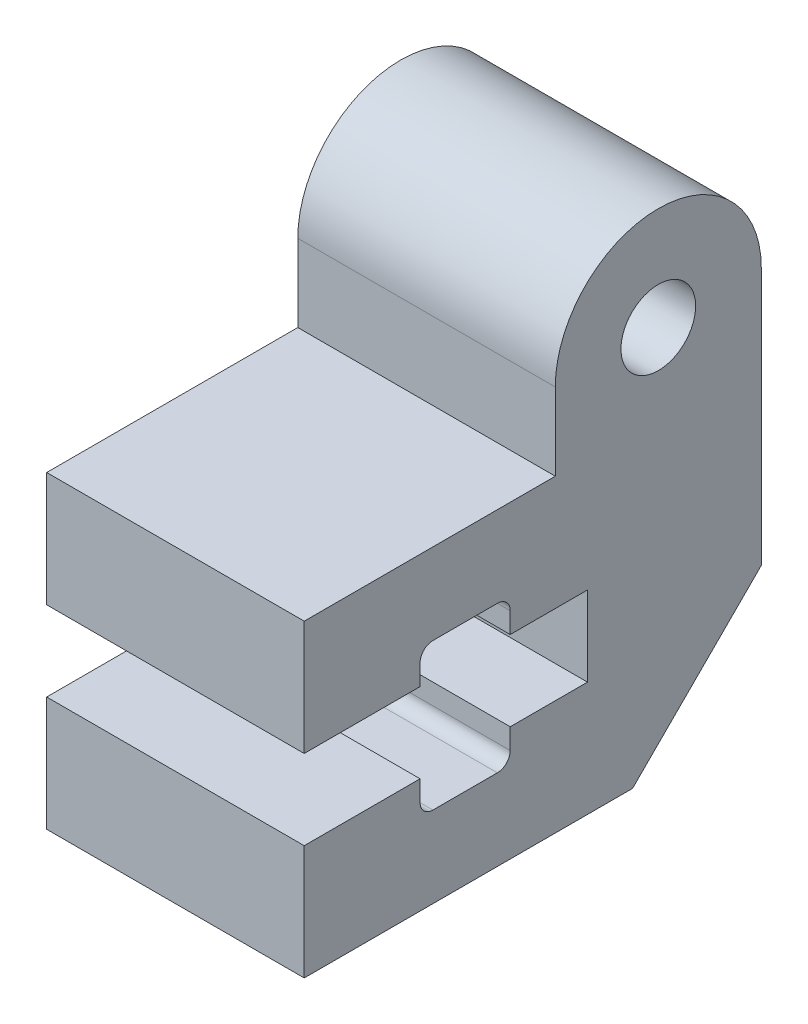
ISO-10303-21;
HEADER;
FILE_DESCRIPTION(('STEP AP214'),'2;1');
FILE_NAME('part.step','',(''),(''),'','','');
FILE_SCHEMA(('AUTOMOTIVE_DESIGN { 1 0 10303 214 1 1 1 1 }'));
ENDSEC;
DATA;
#1=APPLICATION_CONTEXT('core data for automotive mechanical design processes');
#2=APPLICATION_PROTOCOL_DEFINITION('international standard','automotive_design',2000,#1);
#3=PRODUCT_CONTEXT('',#1,'mechanical');
#4=PRODUCT('Part','Part','',(#3));
#5=PRODUCT_RELATED_PRODUCT_CATEGORY('part','',(#4));
#6=PRODUCT_DEFINITION_FORMATION('','',#4);
#7=PRODUCT_DEFINITION_CONTEXT('part definition',#1,'design');
#8=PRODUCT_DEFINITION('design','',#6,#7);
#9=PRODUCT_DEFINITION_SHAPE('','',#8);
#10=(LENGTH_UNIT() NAMED_UNIT(*) SI_UNIT(.MILLI.,.METRE.));
#11=(NAMED_UNIT(*) PLANE_ANGLE_UNIT() SI_UNIT($,.RADIAN.));
#12=(NAMED_UNIT(*) SI_UNIT($,.STERADIAN.) SOLID_ANGLE_UNIT());
#13=UNCERTAINTY_MEASURE_WITH_UNIT(LENGTH_MEASURE(1.E-05),#10,'distance_accuracy_value','');
#14=(GEOMETRIC_REPRESENTATION_CONTEXT(3) GLOBAL_UNCERTAINTY_ASSIGNED_CONTEXT((#13)) GLOBAL_UNIT_ASSIGNED_CONTEXT((#10,
#11,#12)) REPRESENTATION_CONTEXT('',''));
#15=CARTESIAN_POINT('',(0.,0.,0.));
#16=DIRECTION('',(0.,0.,1.));
#17=DIRECTION('',(1.,0.,0.));
#18=AXIS2_PLACEMENT_3D('',#15,#16,#17);
#19=CARTESIAN_POINT('',(10.,3.,-13.75));
#20=DIRECTION('',(1.,0.,0.));
#21=DIRECTION('',(0.,0.,-1.));
#22=AXIS2_PLACEMENT_3D('',#19,#20,#21);
#23=PLANE('',#22);
#24=CARTESIAN_POINT('',(10.,3.,-13.75));
#25=DIRECTION('',(1.,0.,0.));
#26=DIRECTION('',(0.,0.,-1.));
#27=AXIS2_PLACEMENT_3D('',#24,#25,#26);
#28=CIRCLE('',#27,1.45);
#29=CARTESIAN_POINT('',(10.,3.,-15.2));
#30=VERTEX_POINT('',#29);
#31=EDGE_CURVE('E165',#30,#30,#28,.T.);
#32=ORIENTED_EDGE('',*,*,#31,.F.);
#33=EDGE_LOOP('',(#32));
#34=FACE_BOUND('',#33,.T.);
#35=DIRECTION('',(0.,0.707106781186549,-0.707106781186546));
#36=VECTOR('',#35,1.);
#37=CARTESIAN_POINT('',(10.,-6.99999999999998,-17.75));
#38=LINE('',#37,#36);
#39=CARTESIAN_POINT('',(10.,-12.,-12.75));
#40=VERTEX_POINT('',#39);
#41=CARTESIAN_POINT('',(10.,-6.99999999999998,-17.75));
#42=VERTEX_POINT('',#41);
#43=EDGE_CURVE('E308',#40,#42,#38,.T.);
#44=ORIENTED_EDGE('',*,*,#43,.T.);
#45=DIRECTION('',(0.,1.,0.));
#46=VECTOR('',#45,1.);
#47=CARTESIAN_POINT('',(10.,3.,-17.75));
#48=LINE('',#47,#46);
#49=CARTESIAN_POINT('',(10.,3.,-17.75));
#50=VERTEX_POINT('',#49);
#51=EDGE_CURVE('E106',#42,#50,#48,.T.);
#52=ORIENTED_EDGE('',*,*,#51,.T.);
#53=CARTESIAN_POINT('',(10.,3.,-13.75));
#54=DIRECTION('',(1.,0.,0.));
#55=DIRECTION('',(0.,0.,-1.));
#56=AXIS2_PLACEMENT_3D('',#53,#54,#55);
#57=CIRCLE('',#56,4.);
#58=CARTESIAN_POINT('',(10.,3.,-9.75000000000001));
#59=VERTEX_POINT('',#58);
#60=EDGE_CURVE('E99',#50,#59,#57,.T.);
#61=ORIENTED_EDGE('',*,*,#60,.T.);
#62=DIRECTION('',(0.,-1.,0.));
#63=VECTOR('',#62,1.);
#64=CARTESIAN_POINT('',(10.,0.,-9.75000000000001));
#65=LINE('',#64,#63);
#66=CARTESIAN_POINT('',(10.,0.,-9.75000000000001));
#67=VERTEX_POINT('',#66);
#68=EDGE_CURVE('E103',#59,#67,#65,.T.);
#69=ORIENTED_EDGE('',*,*,#68,.T.);
#70=DIRECTION('',(0.,0.,1.));
#71=VECTOR('',#70,1.);
#72=CARTESIAN_POINT('',(10.,0.,0.));
#73=LINE('',#72,#71);
#74=CARTESIAN_POINT('',(10.,0.,0.));
#75=VERTEX_POINT('',#74);
#76=EDGE_CURVE('E58',#67,#75,#73,.T.);
#77=ORIENTED_EDGE('',*,*,#76,.T.);
#78=DIRECTION('',(0.,-1.,0.));
#79=VECTOR('',#78,1.);
#80=CARTESIAN_POINT('',(10.,-12.,0.));
#81=LINE('',#80,#79);
#82=CARTESIAN_POINT('',(10.,-4.45,0.));
#83=VERTEX_POINT('',#82);
#84=EDGE_CURVE('E152',#75,#83,#81,.T.);
#85=ORIENTED_EDGE('',*,*,#84,.T.);
#86=DIRECTION('',(0.,0.,1.));
#87=VECTOR('',#86,1.);
#88=CARTESIAN_POINT('',(10.,-4.45,0.));
#89=LINE('',#88,#87);
#90=CARTESIAN_POINT('',(10.,-4.45,-4.5));
#91=VERTEX_POINT('',#90);
#92=EDGE_CURVE('E257',#91,#83,#89,.T.);
#93=ORIENTED_EDGE('',*,*,#92,.F.);
#94=DIRECTION('',(0.,-1.,0.));
#95=VECTOR('',#94,1.);
#96=CARTESIAN_POINT('',(10.,-4.45,-4.5));
#97=LINE('',#96,#95);
#98=CARTESIAN_POINT('',(10.,-3.65,-4.5));
#99=VERTEX_POINT('',#98);
#100=EDGE_CURVE('E214',#99,#91,#97,.T.);
#101=ORIENTED_EDGE('',*,*,#100,.F.);
#102=CARTESIAN_POINT('',(10.,-3.65,-5.));
#103=DIRECTION('',(1.,0.,0.));
#104=DIRECTION('',(0.,0.,1.));
#105=AXIS2_PLACEMENT_3D('',#102,#103,#104);
#106=CIRCLE('',#105,0.5);
#107=CARTESIAN_POINT('',(10.,-3.15,-5.));
#108=VERTEX_POINT('',#107);
#109=EDGE_CURVE('E218',#108,#99,#106,.T.);
#110=ORIENTED_EDGE('',*,*,#109,.F.);
#111=DIRECTION('',(0.,0.,1.));
#112=VECTOR('',#111,1.);
#113=CARTESIAN_POINT('',(10.,-3.15,-5.));
#114=LINE('',#113,#112);
#115=CARTESIAN_POINT('',(10.,-3.15,-7.5));
#116=VERTEX_POINT('',#115);
#117=EDGE_CURVE('E221',#116,#108,#114,.T.);
#118=ORIENTED_EDGE('',*,*,#117,.F.);
#119=CARTESIAN_POINT('',(10.,-3.65,-7.5));
#120=DIRECTION('',(1.,0.,0.));
#121=DIRECTION('',(0.,0.,1.));
#122=AXIS2_PLACEMENT_3D('',#119,#120,#121);
#123=CIRCLE('',#122,0.5);
#124=CARTESIAN_POINT('',(10.,-3.65,-8.));
#125=VERTEX_POINT('',#124);
#126=EDGE_CURVE('E224',#125,#116,#123,.T.);
#127=ORIENTED_EDGE('',*,*,#126,.F.);
#128=DIRECTION('',(0.,1.,0.));
#129=VECTOR('',#128,1.);
#130=CARTESIAN_POINT('',(10.,-3.65,-8.));
#131=LINE('',#130,#129);
#132=CARTESIAN_POINT('',(10.,-4.45,-8.));
#133=VERTEX_POINT('',#132);
#134=EDGE_CURVE('E227',#133,#125,#131,.T.);
#135=ORIENTED_EDGE('',*,*,#134,.F.);
#136=DIRECTION('',(0.,0.,1.));
#137=VECTOR('',#136,1.);
#138=CARTESIAN_POINT('',(10.,-4.45,-8.));
#139=LINE('',#138,#137);
#140=CARTESIAN_POINT('',(10.,-4.45,-11.));
#141=VERTEX_POINT('',#140);
#142=EDGE_CURVE('E230',#141,#133,#139,.T.);
#143=ORIENTED_EDGE('',*,*,#142,.F.);
#144=DIRECTION('',(0.,1.,0.));
#145=VECTOR('',#144,1.);
#146=CARTESIAN_POINT('',(10.,-4.45,-11.));
#147=LINE('',#146,#145);
#148=CARTESIAN_POINT('',(10.,-7.55,-11.));
#149=VERTEX_POINT('',#148);
#150=EDGE_CURVE('E233',#149,#141,#147,.T.);
#151=ORIENTED_EDGE('',*,*,#150,.F.);
#152=DIRECTION('',(0.,0.,-1.));
#153=VECTOR('',#152,1.);
#154=CARTESIAN_POINT('',(10.,-7.55,-8.));
#155=LINE('',#154,#153);
#156=CARTESIAN_POINT('',(10.,-7.55,-8.));
#157=VERTEX_POINT('',#156);
#158=EDGE_CURVE('E236',#157,#149,#155,.T.);
#159=ORIENTED_EDGE('',*,*,#158,.F.);
#160=DIRECTION('',(0.,1.,0.));
#161=VECTOR('',#160,1.);
#162=CARTESIAN_POINT('',(10.,-8.35,-8.));
#163=LINE('',#162,#161);
#164=CARTESIAN_POINT('',(10.,-8.35,-8.));
#165=VERTEX_POINT('',#164);
#166=EDGE_CURVE('E239',#165,#157,#163,.T.);
#167=ORIENTED_EDGE('',*,*,#166,.F.);
#168=CARTESIAN_POINT('',(10.,-8.35,-7.5));
#169=DIRECTION('',(1.,0.,0.));
#170=DIRECTION('',(0.,0.,-1.));
#171=AXIS2_PLACEMENT_3D('',#168,#169,#170);
#172=CIRCLE('',#171,0.5);
#173=CARTESIAN_POINT('',(10.,-8.85,-7.49999999999999));
#174=VERTEX_POINT('',#173);
#175=EDGE_CURVE('E242',#174,#165,#172,.T.);
#176=ORIENTED_EDGE('',*,*,#175,.F.);
#177=DIRECTION('',(0.,0.,-1.));
#178=VECTOR('',#177,1.);
#179=CARTESIAN_POINT('',(10.,-8.85,-5.));
#180=LINE('',#179,#178);
#181=CARTESIAN_POINT('',(10.,-8.85,-5.));
#182=VERTEX_POINT('',#181);
#183=EDGE_CURVE('E245',#182,#174,#180,.T.);
#184=ORIENTED_EDGE('',*,*,#183,.F.);
#185=CARTESIAN_POINT('',(10.,-8.35,-5.));
#186=DIRECTION('',(1.,0.,0.));
#187=DIRECTION('',(0.,0.,-1.));
#188=AXIS2_PLACEMENT_3D('',#185,#186,#187);
#189=CIRCLE('',#188,0.5);
#190=CARTESIAN_POINT('',(10.,-8.35,-4.5));
#191=VERTEX_POINT('',#190);
#192=EDGE_CURVE('E248',#191,#182,#189,.T.);
#193=ORIENTED_EDGE('',*,*,#192,.F.);
#194=DIRECTION('',(0.,-1.,0.));
#195=VECTOR('',#194,1.);
#196=CARTESIAN_POINT('',(10.,-7.55,-4.5));
#197=LINE('',#196,#195);
#198=CARTESIAN_POINT('',(10.,-7.55,-4.5));
#199=VERTEX_POINT('',#198);
#200=EDGE_CURVE('E251',#199,#191,#197,.T.);
#201=ORIENTED_EDGE('',*,*,#200,.F.);
#202=DIRECTION('',(0.,0.,-1.));
#203=VECTOR('',#202,1.);
#204=CARTESIAN_POINT('',(10.,-7.55,0.));
#205=LINE('',#204,#203);
#206=CARTESIAN_POINT('',(10.,-7.55,0.));
#207=VERTEX_POINT('',#206);
#208=EDGE_CURVE('E254',#207,#199,#205,.T.);
#209=ORIENTED_EDGE('',*,*,#208,.F.);
#210=CARTESIAN_POINT('',(10.,-12.,0.));
#211=VERTEX_POINT('',#210);
#212=EDGE_CURVE('E90',#207,#211,#81,.T.);
#213=ORIENTED_EDGE('',*,*,#212,.T.);
#214=DIRECTION('',(0.,0.,-1.));
#215=VECTOR('',#214,1.);
#216=CARTESIAN_POINT('',(10.,-12.,-17.75));
#217=LINE('',#216,#215);
#218=EDGE_CURVE('E158',#211,#40,#217,.T.);
#219=ORIENTED_EDGE('',*,*,#218,.T.);
#220=EDGE_LOOP('',(#44,#52,#61,#69,#77,#85,#93,#101,#110,#118,#127,#135,#143,#151,#159,#167,
#176,#184,#193,#201,#209,#213,#219));
#221=FACE_BOUND('',#220,.T.);
#222=ADVANCED_FACE('F34',(#34,#221),#23,.T.);
#223=CARTESIAN_POINT('',(0.,3.,-13.75));
#224=DIRECTION('',(1.,0.,0.));
#225=DIRECTION('',(0.,0.,-1.));
#226=AXIS2_PLACEMENT_3D('',#223,#224,#225);
#227=PLANE('',#226);
#228=CARTESIAN_POINT('',(0.,3.,-13.75));
#229=DIRECTION('',(1.,0.,0.));
#230=DIRECTION('',(0.,0.,-1.));
#231=AXIS2_PLACEMENT_3D('',#228,#229,#230);
#232=CIRCLE('',#231,1.45);
#233=CARTESIAN_POINT('',(0.,3.,-15.2));
#234=VERTEX_POINT('',#233);
#235=EDGE_CURVE('E162',#234,#234,#232,.T.);
#236=ORIENTED_EDGE('',*,*,#235,.T.);
#237=EDGE_LOOP('',(#236));
#238=FACE_BOUND('',#237,.T.);
#239=DIRECTION('',(0.,1.,0.));
#240=VECTOR('',#239,1.);
#241=CARTESIAN_POINT('',(0.,3.,-17.75));
#242=LINE('',#241,#240);
#243=CARTESIAN_POINT('',(0.,-6.99999999999998,-17.75));
#244=VERTEX_POINT('',#243);
#245=CARTESIAN_POINT('',(0.,3.,-17.75));
#246=VERTEX_POINT('',#245);
#247=EDGE_CURVE('E133',#244,#246,#242,.T.);
#248=ORIENTED_EDGE('',*,*,#247,.F.);
#249=DIRECTION('',(0.,0.707106781186549,-0.707106781186546));
#250=VECTOR('',#249,1.);
#251=CARTESIAN_POINT('',(0.,-6.99999999999998,-17.75));
#252=LINE('',#251,#250);
#253=CARTESIAN_POINT('',(0.,-12.,-12.75));
#254=VERTEX_POINT('',#253);
#255=EDGE_CURVE('E305',#254,#244,#252,.T.);
#256=ORIENTED_EDGE('',*,*,#255,.F.);
#257=DIRECTION('',(0.,0.,-1.));
#258=VECTOR('',#257,1.);
#259=CARTESIAN_POINT('',(0.,-12.,-17.75));
#260=LINE('',#259,#258);
#261=CARTESIAN_POINT('',(0.,-12.,0.));
#262=VERTEX_POINT('',#261);
#263=EDGE_CURVE('E129',#262,#254,#260,.T.);
#264=ORIENTED_EDGE('',*,*,#263,.F.);
#265=DIRECTION('',(0.,-1.,0.));
#266=VECTOR('',#265,1.);
#267=CARTESIAN_POINT('',(0.,-12.,0.));
#268=LINE('',#267,#266);
#269=CARTESIAN_POINT('',(0.,-7.55,0.));
#270=VERTEX_POINT('',#269);
#271=EDGE_CURVE('E130',#270,#262,#268,.T.);
#272=ORIENTED_EDGE('',*,*,#271,.F.);
#273=DIRECTION('',(0.,0.,-1.));
#274=VECTOR('',#273,1.);
#275=CARTESIAN_POINT('',(0.,-7.55,0.));
#276=LINE('',#275,#274);
#277=CARTESIAN_POINT('',(0.,-7.55,-4.5));
#278=VERTEX_POINT('',#277);
#279=EDGE_CURVE('E49',#270,#278,#276,.T.);
#280=ORIENTED_EDGE('',*,*,#279,.T.);
#281=DIRECTION('',(0.,-1.,0.));
#282=VECTOR('',#281,1.);
#283=CARTESIAN_POINT('',(0.,-7.55,-4.5));
#284=LINE('',#283,#282);
#285=CARTESIAN_POINT('',(0.,-8.35,-4.5));
#286=VERTEX_POINT('',#285);
#287=EDGE_CURVE('E296',#278,#286,#284,.T.);
#288=ORIENTED_EDGE('',*,*,#287,.T.);
#289=CARTESIAN_POINT('',(0.,-8.35,-5.));
#290=DIRECTION('',(1.,0.,0.));
#291=DIRECTION('',(0.,0.,-1.));
#292=AXIS2_PLACEMENT_3D('',#289,#290,#291);
#293=CIRCLE('',#292,0.5);
#294=CARTESIAN_POINT('',(0.,-8.85,-5.));
#295=VERTEX_POINT('',#294);
#296=EDGE_CURVE('E293',#286,#295,#293,.T.);
#297=ORIENTED_EDGE('',*,*,#296,.T.);
#298=DIRECTION('',(0.,0.,-1.));
#299=VECTOR('',#298,1.);
#300=CARTESIAN_POINT('',(0.,-8.85,-5.));
#301=LINE('',#300,#299);
#302=CARTESIAN_POINT('',(0.,-8.85,-7.49999999999999));
#303=VERTEX_POINT('',#302);
#304=EDGE_CURVE('E290',#295,#303,#301,.T.);
#305=ORIENTED_EDGE('',*,*,#304,.T.);
#306=CARTESIAN_POINT('',(0.,-8.35,-7.5));
#307=DIRECTION('',(1.,0.,0.));
#308=DIRECTION('',(0.,0.,-1.));
#309=AXIS2_PLACEMENT_3D('',#306,#307,#308);
#310=CIRCLE('',#309,0.5);
#311=CARTESIAN_POINT('',(0.,-8.35,-8.));
#312=VERTEX_POINT('',#311);
#313=EDGE_CURVE('E287',#303,#312,#310,.T.);
#314=ORIENTED_EDGE('',*,*,#313,.T.);
#315=DIRECTION('',(0.,1.,0.));
#316=VECTOR('',#315,1.);
#317=CARTESIAN_POINT('',(0.,-8.35,-8.));
#318=LINE('',#317,#316);
#319=CARTESIAN_POINT('',(0.,-7.55,-8.));
#320=VERTEX_POINT('',#319);
#321=EDGE_CURVE('E284',#312,#320,#318,.T.);
#322=ORIENTED_EDGE('',*,*,#321,.T.);
#323=DIRECTION('',(0.,0.,-1.));
#324=VECTOR('',#323,1.);
#325=CARTESIAN_POINT('',(0.,-7.55,-8.));
#326=LINE('',#325,#324);
#327=CARTESIAN_POINT('',(0.,-7.55,-11.));
#328=VERTEX_POINT('',#327);
#329=EDGE_CURVE('E281',#320,#328,#326,.T.);
#330=ORIENTED_EDGE('',*,*,#329,.T.);
#331=DIRECTION('',(0.,1.,0.));
#332=VECTOR('',#331,1.);
#333=CARTESIAN_POINT('',(0.,-4.45,-11.));
#334=LINE('',#333,#332);
#335=CARTESIAN_POINT('',(0.,-4.45,-11.));
#336=VERTEX_POINT('',#335);
#337=EDGE_CURVE('E278',#328,#336,#334,.T.);
#338=ORIENTED_EDGE('',*,*,#337,.T.);
#339=DIRECTION('',(0.,0.,1.));
#340=VECTOR('',#339,1.);
#341=CARTESIAN_POINT('',(0.,-4.45,-8.));
#342=LINE('',#341,#340);
#343=CARTESIAN_POINT('',(0.,-4.45,-8.));
#344=VERTEX_POINT('',#343);
#345=EDGE_CURVE('E275',#336,#344,#342,.T.);
#346=ORIENTED_EDGE('',*,*,#345,.T.);
#347=DIRECTION('',(0.,1.,0.));
#348=VECTOR('',#347,1.);
#349=CARTESIAN_POINT('',(0.,-3.65,-8.));
#350=LINE('',#349,#348);
#351=CARTESIAN_POINT('',(0.,-3.65,-8.));
#352=VERTEX_POINT('',#351);
#353=EDGE_CURVE('E272',#344,#352,#350,.T.);
#354=ORIENTED_EDGE('',*,*,#353,.T.);
#355=CARTESIAN_POINT('',(0.,-3.65,-7.5));
#356=DIRECTION('',(1.,0.,0.));
#357=DIRECTION('',(0.,0.,1.));
#358=AXIS2_PLACEMENT_3D('',#355,#356,#357);
#359=CIRCLE('',#358,0.5);
#360=CARTESIAN_POINT('',(0.,-3.15,-7.5));
#361=VERTEX_POINT('',#360);
#362=EDGE_CURVE('E269',#352,#361,#359,.T.);
#363=ORIENTED_EDGE('',*,*,#362,.T.);
#364=DIRECTION('',(0.,0.,1.));
#365=VECTOR('',#364,1.);
#366=CARTESIAN_POINT('',(0.,-3.15,-5.));
#367=LINE('',#366,#365);
#368=CARTESIAN_POINT('',(0.,-3.15,-5.));
#369=VERTEX_POINT('',#368);
#370=EDGE_CURVE('E266',#361,#369,#367,.T.);
#371=ORIENTED_EDGE('',*,*,#370,.T.);
#372=CARTESIAN_POINT('',(0.,-3.65,-5.));
#373=DIRECTION('',(1.,0.,0.));
#374=DIRECTION('',(0.,0.,1.));
#375=AXIS2_PLACEMENT_3D('',#372,#373,#374);
#376=CIRCLE('',#375,0.5);
#377=CARTESIAN_POINT('',(0.,-3.65,-4.5));
#378=VERTEX_POINT('',#377);
#379=EDGE_CURVE('E263',#369,#378,#376,.T.);
#380=ORIENTED_EDGE('',*,*,#379,.T.);
#381=DIRECTION('',(0.,-1.,0.));
#382=VECTOR('',#381,1.);
#383=CARTESIAN_POINT('',(0.,-4.45,-4.5));
#384=LINE('',#383,#382);
#385=CARTESIAN_POINT('',(0.,-4.45,-4.5));
#386=VERTEX_POINT('',#385);
#387=EDGE_CURVE('E171',#378,#386,#384,.T.);
#388=ORIENTED_EDGE('',*,*,#387,.T.);
#389=DIRECTION('',(0.,0.,1.));
#390=VECTOR('',#389,1.);
#391=CARTESIAN_POINT('',(0.,-4.45,0.));
#392=LINE('',#391,#390);
#393=CARTESIAN_POINT('',(0.,-4.45,0.));
#394=VERTEX_POINT('',#393);
#395=EDGE_CURVE('E217',#386,#394,#392,.T.);
#396=ORIENTED_EDGE('',*,*,#395,.T.);
#397=CARTESIAN_POINT('',(0.,0.,0.));
#398=VERTEX_POINT('',#397);
#399=EDGE_CURVE('E126',#398,#394,#268,.T.);
#400=ORIENTED_EDGE('',*,*,#399,.F.);
#401=DIRECTION('',(0.,0.,1.));
#402=VECTOR('',#401,1.);
#403=CARTESIAN_POINT('',(0.,0.,0.));
#404=LINE('',#403,#402);
#405=CARTESIAN_POINT('',(0.,0.,-9.75000000000001));
#406=VERTEX_POINT('',#405);
#407=EDGE_CURVE('E82',#406,#398,#404,.T.);
#408=ORIENTED_EDGE('',*,*,#407,.F.);
#409=DIRECTION('',(0.,-1.,0.));
#410=VECTOR('',#409,1.);
#411=CARTESIAN_POINT('',(0.,0.,-9.75000000000001));
#412=LINE('',#411,#410);
#413=CARTESIAN_POINT('',(0.,3.,-9.75000000000001));
#414=VERTEX_POINT('',#413);
#415=EDGE_CURVE('E136',#414,#406,#412,.T.);
#416=ORIENTED_EDGE('',*,*,#415,.F.);
#417=CARTESIAN_POINT('',(0.,3.,-13.75));
#418=DIRECTION('',(1.,0.,0.));
#419=DIRECTION('',(0.,0.,-1.));
#420=AXIS2_PLACEMENT_3D('',#417,#418,#419);
#421=CIRCLE('',#420,4.);
#422=EDGE_CURVE('E115',#246,#414,#421,.T.);
#423=ORIENTED_EDGE('',*,*,#422,.F.);
#424=EDGE_LOOP('',(#248,#256,#264,#272,#280,#288,#297,#305,#314,#322,#330,#338,#346,#354,#363,
#371,#380,#388,#396,#400,#408,#416,#423));
#425=FACE_BOUND('',#424,.T.);
#426=ADVANCED_FACE('F143',(#238,#425),#227,.F.);
#427=CARTESIAN_POINT('',(10.,-12.,-17.75));
#428=DIRECTION('',(0.,1.,0.));
#429=DIRECTION('',(0.,0.,1.));
#430=AXIS2_PLACEMENT_3D('',#427,#428,#429);
#431=PLANE('',#430);
#432=DIRECTION('',(1.,0.,0.));
#433=VECTOR('',#432,1.);
#434=CARTESIAN_POINT('',(0.,-12.,-12.75));
#435=LINE('',#434,#433);
#436=EDGE_CURVE('E302',#254,#40,#435,.T.);
#437=ORIENTED_EDGE('',*,*,#436,.T.);
#438=ORIENTED_EDGE('',*,*,#218,.F.);
#439=DIRECTION('',(-1.,0.,0.));
#440=VECTOR('',#439,1.);
#441=CARTESIAN_POINT('',(10.,-12.,0.));
#442=LINE('',#441,#440);
#443=EDGE_CURVE('E12',#211,#262,#442,.T.);
#444=ORIENTED_EDGE('',*,*,#443,.T.);
#445=ORIENTED_EDGE('',*,*,#263,.T.);
#446=EDGE_LOOP('',(#437,#438,#444,#445));
#447=FACE_BOUND('',#446,.T.);
#448=ADVANCED_FACE('F322',(#447),#431,.F.);
#449=CARTESIAN_POINT('',(10.,-12.,0.));
#450=DIRECTION('',(0.,0.,-1.));
#451=DIRECTION('',(-1.,0.,0.));
#452=AXIS2_PLACEMENT_3D('',#449,#450,#451);
#453=PLANE('',#452);
#454=ORIENTED_EDGE('',*,*,#399,.T.);
#455=DIRECTION('',(1.,0.,0.));
#456=VECTOR('',#455,1.);
#457=CARTESIAN_POINT('',(0.,-4.45,0.));
#458=LINE('',#457,#456);
#459=EDGE_CURVE('E156',#394,#83,#458,.T.);
#460=ORIENTED_EDGE('',*,*,#459,.T.);
#461=ORIENTED_EDGE('',*,*,#84,.F.);
#462=DIRECTION('',(-1.,0.,0.));
#463=VECTOR('',#462,1.);
#464=CARTESIAN_POINT('',(10.,0.,0.));
#465=LINE('',#464,#463);
#466=EDGE_CURVE('E122',#75,#398,#465,.T.);
#467=ORIENTED_EDGE('',*,*,#466,.T.);
#468=EDGE_LOOP('',(#454,#460,#461,#467));
#469=FACE_BOUND('',#468,.T.);
#470=ADVANCED_FACE('F153',(#469),#453,.F.);
#471=ORIENTED_EDGE('',*,*,#212,.F.);
#472=DIRECTION('',(1.,0.,0.));
#473=VECTOR('',#472,1.);
#474=CARTESIAN_POINT('',(0.,-7.55,0.));
#475=LINE('',#474,#473);
#476=EDGE_CURVE('E170',#270,#207,#475,.T.);
#477=ORIENTED_EDGE('',*,*,#476,.F.);
#478=ORIENTED_EDGE('',*,*,#271,.T.);
#479=ORIENTED_EDGE('',*,*,#443,.F.);
#480=EDGE_LOOP('',(#471,#477,#478,#479));
#481=FACE_BOUND('',#480,.T.);
#482=ADVANCED_FACE('F36',(#481),#453,.F.);
#483=CARTESIAN_POINT('',(10.,3.,-17.75));
#484=DIRECTION('',(0.,0.,1.));
#485=DIRECTION('',(1.,0.,0.));
#486=AXIS2_PLACEMENT_3D('',#483,#484,#485);
#487=PLANE('',#486);
#488=ORIENTED_EDGE('',*,*,#247,.T.);
#489=DIRECTION('',(-1.,0.,0.));
#490=VECTOR('',#489,1.);
#491=CARTESIAN_POINT('',(10.,3.,-17.75));
#492=LINE('',#491,#490);
#493=EDGE_CURVE('E42',#50,#246,#492,.T.);
#494=ORIENTED_EDGE('',*,*,#493,.F.);
#495=ORIENTED_EDGE('',*,*,#51,.F.);
#496=DIRECTION('',(1.,0.,0.));
#497=VECTOR('',#496,1.);
#498=CARTESIAN_POINT('',(0.,-6.99999999999998,-17.75));
#499=LINE('',#498,#497);
#500=EDGE_CURVE('E260',#244,#42,#499,.T.);
#501=ORIENTED_EDGE('',*,*,#500,.F.);
#502=EDGE_LOOP('',(#488,#494,#495,#501));
#503=FACE_BOUND('',#502,.T.);
#504=ADVANCED_FACE('F480',(#503),#487,.F.);
#505=CARTESIAN_POINT('',(10.,3.,-13.75));
#506=DIRECTION('',(-1.,0.,0.));
#507=DIRECTION('',(0.,0.,1.));
#508=AXIS2_PLACEMENT_3D('',#505,#506,#507);
#509=CYLINDRICAL_SURFACE('',#508,4.);
#510=ORIENTED_EDGE('',*,*,#422,.T.);
#511=DIRECTION('',(-1.,0.,0.));
#512=VECTOR('',#511,1.);
#513=CARTESIAN_POINT('',(10.,3.,-9.75000000000001));
#514=LINE('',#513,#512);
#515=EDGE_CURVE('E112',#59,#414,#514,.T.);
#516=ORIENTED_EDGE('',*,*,#515,.F.);
#517=ORIENTED_EDGE('',*,*,#60,.F.);
#518=ORIENTED_EDGE('',*,*,#493,.T.);
#519=EDGE_LOOP('',(#510,#516,#517,#518));
#520=FACE_BOUND('',#519,.T.);
#521=ADVANCED_FACE('F113',(#520),#509,.T.);
#522=CARTESIAN_POINT('',(10.,0.,-9.75000000000001));
#523=DIRECTION('',(0.,0.,-1.));
#524=DIRECTION('',(0.,1.,0.));
#525=AXIS2_PLACEMENT_3D('',#522,#523,#524);
#526=PLANE('',#525);
#527=ORIENTED_EDGE('',*,*,#415,.T.);
#528=DIRECTION('',(-1.,0.,0.));
#529=VECTOR('',#528,1.);
#530=CARTESIAN_POINT('',(10.,0.,-9.75000000000001));
#531=LINE('',#530,#529);
#532=EDGE_CURVE('E118',#67,#406,#531,.T.);
#533=ORIENTED_EDGE('',*,*,#532,.F.);
#534=ORIENTED_EDGE('',*,*,#68,.F.);
#535=ORIENTED_EDGE('',*,*,#515,.T.);
#536=EDGE_LOOP('',(#527,#533,#534,#535));
#537=FACE_BOUND('',#536,.T.);
#538=ADVANCED_FACE('F120',(#537),#526,.F.);
#539=CARTESIAN_POINT('',(10.,0.,0.));
#540=DIRECTION('',(0.,-1.,0.));
#541=DIRECTION('',(0.,0.,-1.));
#542=AXIS2_PLACEMENT_3D('',#539,#540,#541);
#543=PLANE('',#542);
#544=ORIENTED_EDGE('',*,*,#407,.T.);
#545=ORIENTED_EDGE('',*,*,#466,.F.);
#546=ORIENTED_EDGE('',*,*,#76,.F.);
#547=ORIENTED_EDGE('',*,*,#532,.T.);
#548=EDGE_LOOP('',(#544,#545,#546,#547));
#549=FACE_BOUND('',#548,.T.);
#550=ADVANCED_FACE('F148',(#549),#543,.F.);
#551=CARTESIAN_POINT('',(10.,3.,-13.75));
#552=DIRECTION('',(-1.,0.,0.));
#553=DIRECTION('',(0.,0.,1.));
#554=AXIS2_PLACEMENT_3D('',#551,#552,#553);
#555=CYLINDRICAL_SURFACE('',#554,1.45);
#556=ORIENTED_EDGE('',*,*,#31,.T.);
#557=EDGE_LOOP('',(#556));
#558=FACE_BOUND('',#557,.T.);
#559=ORIENTED_EDGE('',*,*,#235,.F.);
#560=EDGE_LOOP('',(#559));
#561=FACE_BOUND('',#560,.T.);
#562=ADVANCED_FACE('F472',(#558,#561),#555,.F.);
#563=CARTESIAN_POINT('',(0.,-4.45,0.));
#564=DIRECTION('',(0.,1.,0.));
#565=DIRECTION('',(0.,0.,1.));
#566=AXIS2_PLACEMENT_3D('',#563,#564,#565);
#567=PLANE('',#566);
#568=ORIENTED_EDGE('',*,*,#92,.T.);
#569=ORIENTED_EDGE('',*,*,#459,.F.);
#570=ORIENTED_EDGE('',*,*,#395,.F.);
#571=DIRECTION('',(1.,0.,0.));
#572=VECTOR('',#571,1.);
#573=CARTESIAN_POINT('',(0.,-4.45,-4.5));
#574=LINE('',#573,#572);
#575=EDGE_CURVE('E166',#386,#91,#574,.T.);
#576=ORIENTED_EDGE('',*,*,#575,.T.);
#577=EDGE_LOOP('',(#568,#569,#570,#576));
#578=FACE_BOUND('',#577,.T.);
#579=ADVANCED_FACE('F402',(#578),#567,.F.);
#580=CARTESIAN_POINT('',(0.,-4.45,-4.5));
#581=DIRECTION('',(0.,0.,1.));
#582=DIRECTION('',(1.,0.,0.));
#583=AXIS2_PLACEMENT_3D('',#580,#581,#582);
#584=PLANE('',#583);
#585=ORIENTED_EDGE('',*,*,#100,.T.);
#586=ORIENTED_EDGE('',*,*,#575,.F.);
#587=ORIENTED_EDGE('',*,*,#387,.F.);
#588=DIRECTION('',(1.,0.,0.));
#589=VECTOR('',#588,1.);
#590=CARTESIAN_POINT('',(0.,-3.65,-4.5));
#591=LINE('',#590,#589);
#592=EDGE_CURVE('E209',#378,#99,#591,.T.);
#593=ORIENTED_EDGE('',*,*,#592,.T.);
#594=EDGE_LOOP('',(#585,#586,#587,#593));
#595=FACE_BOUND('',#594,.T.);
#596=ADVANCED_FACE('F404',(#595),#584,.F.);
#597=CARTESIAN_POINT('',(0.,-3.65,-5.));
#598=DIRECTION('',(1.,0.,0.));
#599=DIRECTION('',(0.,0.,-1.));
#600=AXIS2_PLACEMENT_3D('',#597,#598,#599);
#601=CYLINDRICAL_SURFACE('',#600,0.5);
#602=ORIENTED_EDGE('',*,*,#109,.T.);
#603=ORIENTED_EDGE('',*,*,#592,.F.);
#604=ORIENTED_EDGE('',*,*,#379,.F.);
#605=DIRECTION('',(1.,0.,0.));
#606=VECTOR('',#605,1.);
#607=CARTESIAN_POINT('',(0.,-3.15,-5.));
#608=LINE('',#607,#606);
#609=EDGE_CURVE('E206',#369,#108,#608,.T.);
#610=ORIENTED_EDGE('',*,*,#609,.T.);
#611=EDGE_LOOP('',(#602,#603,#604,#610));
#612=FACE_BOUND('',#611,.T.);
#613=ADVANCED_FACE('F409',(#612),#601,.F.);
#614=CARTESIAN_POINT('',(0.,-3.15,-5.));
#615=DIRECTION('',(0.,1.,0.));
#616=DIRECTION('',(0.,0.,1.));
#617=AXIS2_PLACEMENT_3D('',#614,#615,#616);
#618=PLANE('',#617);
#619=ORIENTED_EDGE('',*,*,#117,.T.);
#620=ORIENTED_EDGE('',*,*,#609,.F.);
#621=ORIENTED_EDGE('',*,*,#370,.F.);
#622=DIRECTION('',(1.,0.,0.));
#623=VECTOR('',#622,1.);
#624=CARTESIAN_POINT('',(0.,-3.15,-7.5));
#625=LINE('',#624,#623);
#626=EDGE_CURVE('E203',#361,#116,#625,.T.);
#627=ORIENTED_EDGE('',*,*,#626,.T.);
#628=EDGE_LOOP('',(#619,#620,#621,#627));
#629=FACE_BOUND('',#628,.T.);
#630=ADVANCED_FACE('F413',(#629),#618,.F.);
#631=CARTESIAN_POINT('',(0.,-3.65,-7.5));
#632=DIRECTION('',(1.,0.,0.));
#633=DIRECTION('',(0.,0.,-1.));
#634=AXIS2_PLACEMENT_3D('',#631,#632,#633);
#635=CYLINDRICAL_SURFACE('',#634,0.5);
#636=ORIENTED_EDGE('',*,*,#126,.T.);
#637=ORIENTED_EDGE('',*,*,#626,.F.);
#638=ORIENTED_EDGE('',*,*,#362,.F.);
#639=DIRECTION('',(1.,0.,0.));
#640=VECTOR('',#639,1.);
#641=CARTESIAN_POINT('',(0.,-3.65,-8.));
#642=LINE('',#641,#640);
#643=EDGE_CURVE('E200',#352,#125,#642,.T.);
#644=ORIENTED_EDGE('',*,*,#643,.T.);
#645=EDGE_LOOP('',(#636,#637,#638,#644));
#646=FACE_BOUND('',#645,.T.);
#647=ADVANCED_FACE('F416',(#646),#635,.F.);
#648=CARTESIAN_POINT('',(0.,-3.65,-8.));
#649=DIRECTION('',(0.,0.,-1.));
#650=DIRECTION('',(-1.,0.,0.));
#651=AXIS2_PLACEMENT_3D('',#648,#649,#650);
#652=PLANE('',#651);
#653=ORIENTED_EDGE('',*,*,#134,.T.);
#654=ORIENTED_EDGE('',*,*,#643,.F.);
#655=ORIENTED_EDGE('',*,*,#353,.F.);
#656=DIRECTION('',(1.,0.,0.));
#657=VECTOR('',#656,1.);
#658=CARTESIAN_POINT('',(0.,-4.45,-8.));
#659=LINE('',#658,#657);
#660=EDGE_CURVE('E197',#344,#133,#659,.T.);
#661=ORIENTED_EDGE('',*,*,#660,.T.);
#662=EDGE_LOOP('',(#653,#654,#655,#661));
#663=FACE_BOUND('',#662,.T.);
#664=ADVANCED_FACE('F421',(#663),#652,.F.);
#665=CARTESIAN_POINT('',(0.,-4.45,-8.));
#666=DIRECTION('',(0.,1.,0.));
#667=DIRECTION('',(0.,0.,1.));
#668=AXIS2_PLACEMENT_3D('',#665,#666,#667);
#669=PLANE('',#668);
#670=ORIENTED_EDGE('',*,*,#142,.T.);
#671=ORIENTED_EDGE('',*,*,#660,.F.);
#672=ORIENTED_EDGE('',*,*,#345,.F.);
#673=DIRECTION('',(1.,0.,0.));
#674=VECTOR('',#673,1.);
#675=CARTESIAN_POINT('',(0.,-4.45,-11.));
#676=LINE('',#675,#674);
#677=EDGE_CURVE('E194',#336,#141,#676,.T.);
#678=ORIENTED_EDGE('',*,*,#677,.T.);
#679=EDGE_LOOP('',(#670,#671,#672,#678));
#680=FACE_BOUND('',#679,.T.);
#681=ADVANCED_FACE('F425',(#680),#669,.F.);
#682=CARTESIAN_POINT('',(0.,-4.45,-11.));
#683=DIRECTION('',(0.,0.,-1.));
#684=DIRECTION('',(-1.,0.,0.));
#685=AXIS2_PLACEMENT_3D('',#682,#683,#684);
#686=PLANE('',#685);
#687=ORIENTED_EDGE('',*,*,#150,.T.);
#688=ORIENTED_EDGE('',*,*,#677,.F.);
#689=ORIENTED_EDGE('',*,*,#337,.F.);
#690=DIRECTION('',(1.,0.,0.));
#691=VECTOR('',#690,1.);
#692=CARTESIAN_POINT('',(0.,-7.55,-11.));
#693=LINE('',#692,#691);
#694=EDGE_CURVE('E191',#328,#149,#693,.T.);
#695=ORIENTED_EDGE('',*,*,#694,.T.);
#696=EDGE_LOOP('',(#687,#688,#689,#695));
#697=FACE_BOUND('',#696,.T.);
#698=ADVANCED_FACE('F428',(#697),#686,.F.);
#699=CARTESIAN_POINT('',(0.,-7.55,-8.));
#700=DIRECTION('',(0.,-1.,0.));
#701=DIRECTION('',(0.,0.,-1.));
#702=AXIS2_PLACEMENT_3D('',#699,#700,#701);
#703=PLANE('',#702);
#704=ORIENTED_EDGE('',*,*,#158,.T.);
#705=ORIENTED_EDGE('',*,*,#694,.F.);
#706=ORIENTED_EDGE('',*,*,#329,.F.);
#707=DIRECTION('',(1.,0.,0.));
#708=VECTOR('',#707,1.);
#709=CARTESIAN_POINT('',(0.,-7.55,-8.));
#710=LINE('',#709,#708);
#711=EDGE_CURVE('E188',#320,#157,#710,.T.);
#712=ORIENTED_EDGE('',*,*,#711,.T.);
#713=EDGE_LOOP('',(#704,#705,#706,#712));
#714=FACE_BOUND('',#713,.T.);
#715=ADVANCED_FACE('F433',(#714),#703,.F.);
#716=CARTESIAN_POINT('',(0.,-8.35,-8.));
#717=DIRECTION('',(0.,0.,-1.));
#718=DIRECTION('',(-1.,0.,0.));
#719=AXIS2_PLACEMENT_3D('',#716,#717,#718);
#720=PLANE('',#719);
#721=ORIENTED_EDGE('',*,*,#166,.T.);
#722=ORIENTED_EDGE('',*,*,#711,.F.);
#723=ORIENTED_EDGE('',*,*,#321,.F.);
#724=DIRECTION('',(1.,0.,0.));
#725=VECTOR('',#724,1.);
#726=CARTESIAN_POINT('',(0.,-8.35,-8.));
#727=LINE('',#726,#725);
#728=EDGE_CURVE('E185',#312,#165,#727,.T.);
#729=ORIENTED_EDGE('',*,*,#728,.T.);
#730=EDGE_LOOP('',(#721,#722,#723,#729));
#731=FACE_BOUND('',#730,.T.);
#732=ADVANCED_FACE('F437',(#731),#720,.F.);
#733=CARTESIAN_POINT('',(0.,-8.35,-7.5));
#734=DIRECTION('',(1.,0.,0.));
#735=DIRECTION('',(0.,0.,-1.));
#736=AXIS2_PLACEMENT_3D('',#733,#734,#735);
#737=CYLINDRICAL_SURFACE('',#736,0.5);
#738=ORIENTED_EDGE('',*,*,#175,.T.);
#739=ORIENTED_EDGE('',*,*,#728,.F.);
#740=ORIENTED_EDGE('',*,*,#313,.F.);
#741=DIRECTION('',(1.,0.,0.));
#742=VECTOR('',#741,1.);
#743=CARTESIAN_POINT('',(0.,-8.85,-7.49999999999999));
#744=LINE('',#743,#742);
#745=EDGE_CURVE('E182',#303,#174,#744,.T.);
#746=ORIENTED_EDGE('',*,*,#745,.T.);
#747=EDGE_LOOP('',(#738,#739,#740,#746));
#748=FACE_BOUND('',#747,.T.);
#749=ADVANCED_FACE('F440',(#748),#737,.F.);
#750=CARTESIAN_POINT('',(0.,-8.85,-5.));
#751=DIRECTION('',(0.,-1.,0.));
#752=DIRECTION('',(0.,0.,-1.));
#753=AXIS2_PLACEMENT_3D('',#750,#751,#752);
#754=PLANE('',#753);
#755=ORIENTED_EDGE('',*,*,#183,.T.);
#756=ORIENTED_EDGE('',*,*,#745,.F.);
#757=ORIENTED_EDGE('',*,*,#304,.F.);
#758=DIRECTION('',(1.,0.,0.));
#759=VECTOR('',#758,1.);
#760=CARTESIAN_POINT('',(0.,-8.85,-5.));
#761=LINE('',#760,#759);
#762=EDGE_CURVE('E179',#295,#182,#761,.T.);
#763=ORIENTED_EDGE('',*,*,#762,.T.);
#764=EDGE_LOOP('',(#755,#756,#757,#763));
#765=FACE_BOUND('',#764,.T.);
#766=ADVANCED_FACE('F445',(#765),#754,.F.);
#767=CARTESIAN_POINT('',(0.,-8.35,-5.));
#768=DIRECTION('',(1.,0.,0.));
#769=DIRECTION('',(0.,0.,-1.));
#770=AXIS2_PLACEMENT_3D('',#767,#768,#769);
#771=CYLINDRICAL_SURFACE('',#770,0.5);
#772=ORIENTED_EDGE('',*,*,#192,.T.);
#773=ORIENTED_EDGE('',*,*,#762,.F.);
#774=ORIENTED_EDGE('',*,*,#296,.F.);
#775=DIRECTION('',(1.,0.,0.));
#776=VECTOR('',#775,1.);
#777=CARTESIAN_POINT('',(0.,-8.35,-4.5));
#778=LINE('',#777,#776);
#779=EDGE_CURVE('E176',#286,#191,#778,.T.);
#780=ORIENTED_EDGE('',*,*,#779,.T.);
#781=EDGE_LOOP('',(#772,#773,#774,#780));
#782=FACE_BOUND('',#781,.T.);
#783=ADVANCED_FACE('F449',(#782),#771,.F.);
#784=CARTESIAN_POINT('',(0.,-7.55,-4.5));
#785=DIRECTION('',(0.,0.,1.));
#786=DIRECTION('',(1.,0.,0.));
#787=AXIS2_PLACEMENT_3D('',#784,#785,#786);
#788=PLANE('',#787);
#789=ORIENTED_EDGE('',*,*,#200,.T.);
#790=ORIENTED_EDGE('',*,*,#779,.F.);
#791=ORIENTED_EDGE('',*,*,#287,.F.);
#792=DIRECTION('',(1.,0.,0.));
#793=VECTOR('',#792,1.);
#794=CARTESIAN_POINT('',(0.,-7.55,-4.5));
#795=LINE('',#794,#793);
#796=EDGE_CURVE('E173',#278,#199,#795,.T.);
#797=ORIENTED_EDGE('',*,*,#796,.T.);
#798=EDGE_LOOP('',(#789,#790,#791,#797));
#799=FACE_BOUND('',#798,.T.);
#800=ADVANCED_FACE('F451',(#799),#788,.F.);
#801=CARTESIAN_POINT('',(0.,-7.55,0.));
#802=DIRECTION('',(0.,-1.,0.));
#803=DIRECTION('',(0.,0.,-1.));
#804=AXIS2_PLACEMENT_3D('',#801,#802,#803);
#805=PLANE('',#804);
#806=ORIENTED_EDGE('',*,*,#208,.T.);
#807=ORIENTED_EDGE('',*,*,#796,.F.);
#808=ORIENTED_EDGE('',*,*,#279,.F.);
#809=ORIENTED_EDGE('',*,*,#476,.T.);
#810=EDGE_LOOP('',(#806,#807,#808,#809));
#811=FACE_BOUND('',#810,.T.);
#812=ADVANCED_FACE('F452',(#811),#805,.F.);
#813=CARTESIAN_POINT('',(0.,-6.99999999999998,-17.75));
#814=DIRECTION('',(0.,-0.707106781186546,-0.707106781186549));
#815=DIRECTION('',(0.,0.707106781186549,-0.707106781186546));
#816=AXIS2_PLACEMENT_3D('',#813,#814,#815);
#817=PLANE('',#816);
#818=ORIENTED_EDGE('',*,*,#43,.F.);
#819=ORIENTED_EDGE('',*,*,#436,.F.);
#820=ORIENTED_EDGE('',*,*,#255,.T.);
#821=ORIENTED_EDGE('',*,*,#500,.T.);
#822=EDGE_LOOP('',(#818,#819,#820,#821));
#823=FACE_BOUND('',#822,.T.);
#824=ADVANCED_FACE('F314',(#823),#817,.T.);
#825=CLOSED_SHELL('',(#222,#426,#448,#470,#482,#504,#521,#538,#550,#562,#579,#596,#613,#630,
#647,#664,#681,#698,#715,#732,#749,#766,#783,#800,#812,#824));
#826=MANIFOLD_SOLID_BREP('B2',#825);
#827=ADVANCED_BREP_SHAPE_REPRESENTATION('',(#18,#826),#14);
#828=SHAPE_DEFINITION_REPRESENTATION(#9,#827);
ENDSEC;
END-ISO-10303-21;
